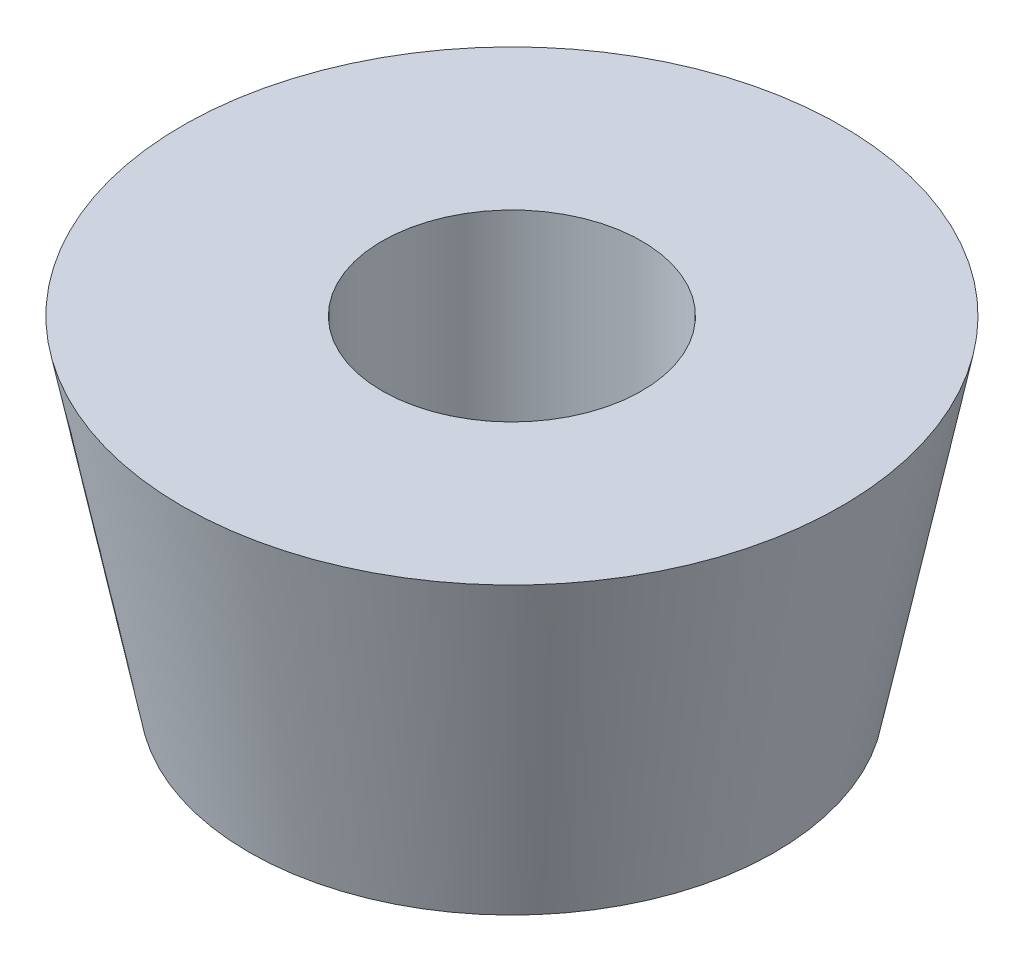
ISO-10303-21;
HEADER;
FILE_DESCRIPTION(('STEP AP214'),'2;1');
FILE_NAME('part.step','',(''),(''),'','','');
FILE_SCHEMA(('AUTOMOTIVE_DESIGN { 1 0 10303 214 1 1 1 1 }'));
ENDSEC;
DATA;
#1=APPLICATION_CONTEXT('core data for automotive mechanical design processes');
#2=APPLICATION_PROTOCOL_DEFINITION('international standard','automotive_design',2000,#1);
#3=PRODUCT_CONTEXT('',#1,'mechanical');
#4=PRODUCT('Part','Part','',(#3));
#5=PRODUCT_RELATED_PRODUCT_CATEGORY('part','',(#4));
#6=PRODUCT_DEFINITION_FORMATION('','',#4);
#7=PRODUCT_DEFINITION_CONTEXT('part definition',#1,'design');
#8=PRODUCT_DEFINITION('design','',#6,#7);
#9=PRODUCT_DEFINITION_SHAPE('','',#8);
#10=(LENGTH_UNIT() NAMED_UNIT(*) SI_UNIT(.MILLI.,.METRE.));
#11=(NAMED_UNIT(*) PLANE_ANGLE_UNIT() SI_UNIT($,.RADIAN.));
#12=(NAMED_UNIT(*) SI_UNIT($,.STERADIAN.) SOLID_ANGLE_UNIT());
#13=UNCERTAINTY_MEASURE_WITH_UNIT(LENGTH_MEASURE(1.E-05),#10,'distance_accuracy_value','');
#14=(GEOMETRIC_REPRESENTATION_CONTEXT(3) GLOBAL_UNCERTAINTY_ASSIGNED_CONTEXT((#13)) GLOBAL_UNIT_ASSIGNED_CONTEXT((#10,
#11,#12)) REPRESENTATION_CONTEXT('',''));
#15=CARTESIAN_POINT('',(0.,0.,0.));
#16=DIRECTION('',(0.,0.,1.));
#17=DIRECTION('',(1.,0.,0.));
#18=AXIS2_PLACEMENT_3D('',#15,#16,#17);
#19=CARTESIAN_POINT('',(4.95,0.,0.));
#20=DIRECTION('',(0.,-1.,0.));
#21=DIRECTION('',(0.,0.,-1.));
#22=AXIS2_PLACEMENT_3D('',#19,#20,#21);
#23=PLANE('',#22);
#24=CARTESIAN_POINT('',(0.,0.,0.));
#25=DIRECTION('',(0.,1.,0.));
#26=DIRECTION('',(0.,0.,1.));
#27=AXIS2_PLACEMENT_3D('',#24,#25,#26);
#28=CIRCLE('',#27,1.95);
#29=CARTESIAN_POINT('',(0.,0.,1.95));
#30=VERTEX_POINT('',#29);
#31=EDGE_CURVE('E10',#30,#30,#28,.T.);
#32=ORIENTED_EDGE('',*,*,#31,.F.);
#33=EDGE_LOOP('',(#32));
#34=FACE_BOUND('',#33,.T.);
#35=CARTESIAN_POINT('',(0.,0.,0.));
#36=DIRECTION('',(0.,1.,0.));
#37=DIRECTION('',(0.,0.,1.));
#38=AXIS2_PLACEMENT_3D('',#35,#36,#37);
#39=CIRCLE('',#38,4.95);
#40=CARTESIAN_POINT('',(0.,0.,4.95));
#41=VERTEX_POINT('',#40);
#42=EDGE_CURVE('E51',#41,#41,#39,.T.);
#43=ORIENTED_EDGE('',*,*,#42,.T.);
#44=EDGE_LOOP('',(#43));
#45=FACE_BOUND('',#44,.T.);
#46=ADVANCED_FACE('F37',(#34,#45),#23,.F.);
#47=CARTESIAN_POINT('',(0.,0.,0.));
#48=DIRECTION('',(0.,1.,0.));
#49=DIRECTION('',(0.,0.,1.));
#50=AXIS2_PLACEMENT_3D('',#47,#48,#49);
#51=CYLINDRICAL_SURFACE('',#50,1.95);
#52=CARTESIAN_POINT('',(0.,-5.,0.));
#53=DIRECTION('',(0.,1.,0.));
#54=DIRECTION('',(0.,0.,1.));
#55=AXIS2_PLACEMENT_3D('',#52,#53,#54);
#56=CIRCLE('',#55,1.95);
#57=CARTESIAN_POINT('',(0.,-5.,1.95));
#58=VERTEX_POINT('',#57);
#59=EDGE_CURVE('E43',#58,#58,#56,.T.);
#60=ORIENTED_EDGE('',*,*,#59,.F.);
#61=EDGE_LOOP('',(#60));
#62=FACE_BOUND('',#61,.T.);
#63=ORIENTED_EDGE('',*,*,#31,.T.);
#64=EDGE_LOOP('',(#63));
#65=FACE_BOUND('',#64,.T.);
#66=ADVANCED_FACE('F66',(#62,#65),#51,.F.);
#67=CARTESIAN_POINT('',(1.95,-5.,0.));
#68=DIRECTION('',(0.,1.,0.));
#69=DIRECTION('',(0.,0.,1.));
#70=AXIS2_PLACEMENT_3D('',#67,#68,#69);
#71=PLANE('',#70);
#72=CARTESIAN_POINT('',(0.,-5.,0.));
#73=DIRECTION('',(0.,1.,0.));
#74=DIRECTION('',(0.,0.,1.));
#75=AXIS2_PLACEMENT_3D('',#72,#73,#74);
#76=CIRCLE('',#75,3.95);
#77=CARTESIAN_POINT('',(0.,-5.,3.95));
#78=VERTEX_POINT('',#77);
#79=EDGE_CURVE('E47',#78,#78,#76,.T.);
#80=ORIENTED_EDGE('',*,*,#79,.F.);
#81=EDGE_LOOP('',(#80));
#82=FACE_BOUND('',#81,.T.);
#83=ORIENTED_EDGE('',*,*,#59,.T.);
#84=EDGE_LOOP('',(#83));
#85=FACE_BOUND('',#84,.T.);
#86=ADVANCED_FACE('F61',(#82,#85),#71,.F.);
#87=CARTESIAN_POINT('',(0.,-5.,0.));
#88=DIRECTION('',(0.,1.,0.));
#89=DIRECTION('',(0.,0.,1.));
#90=AXIS2_PLACEMENT_3D('',#87,#88,#89);
#91=CONICAL_SURFACE('',#90,3.95,0.197395559849881);
#92=ORIENTED_EDGE('',*,*,#42,.F.);
#93=EDGE_LOOP('',(#92));
#94=FACE_BOUND('',#93,.T.);
#95=ORIENTED_EDGE('',*,*,#79,.T.);
#96=EDGE_LOOP('',(#95));
#97=FACE_BOUND('',#96,.T.);
#98=ADVANCED_FACE('F58',(#94,#97),#91,.T.);
#99=CLOSED_SHELL('',(#46,#66,#86,#98));
#100=MANIFOLD_SOLID_BREP('B2',#99);
#101=ADVANCED_BREP_SHAPE_REPRESENTATION('',(#18,#100),#14);
#102=SHAPE_DEFINITION_REPRESENTATION(#9,#101);
ENDSEC;
END-ISO-10303-21;
